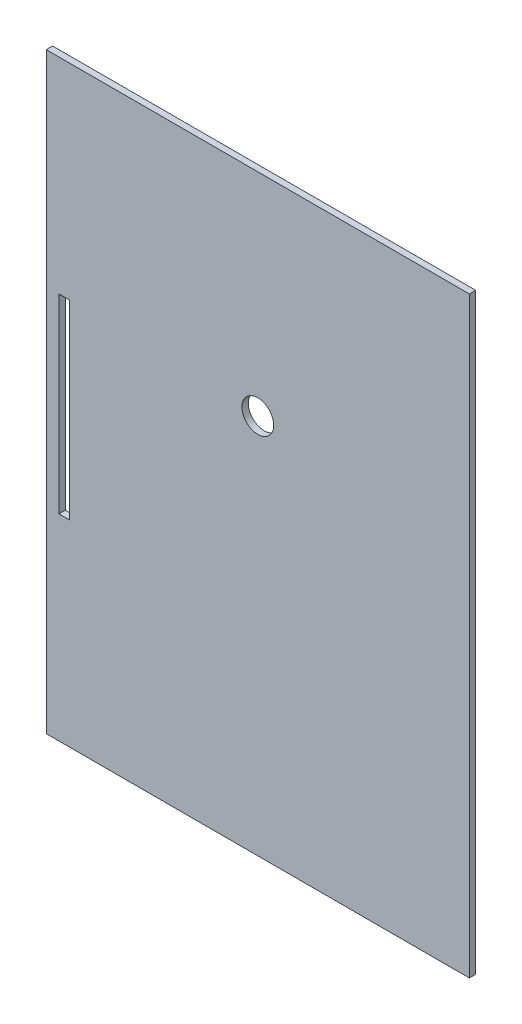
ISO-10303-21;
HEADER;
FILE_DESCRIPTION(('STEP AP214'),'2;1');
FILE_NAME('part.step','',(''),(''),'','','');
FILE_SCHEMA(('AUTOMOTIVE_DESIGN { 1 0 10303 214 1 1 1 1 }'));
ENDSEC;
DATA;
#1=APPLICATION_CONTEXT('core data for automotive mechanical design processes');
#2=APPLICATION_PROTOCOL_DEFINITION('international standard','automotive_design',2000,#1);
#3=PRODUCT_CONTEXT('',#1,'mechanical');
#4=PRODUCT('Part','Part','',(#3));
#5=PRODUCT_RELATED_PRODUCT_CATEGORY('part','',(#4));
#6=PRODUCT_DEFINITION_FORMATION('','',#4);
#7=PRODUCT_DEFINITION_CONTEXT('part definition',#1,'design');
#8=PRODUCT_DEFINITION('design','',#6,#7);
#9=PRODUCT_DEFINITION_SHAPE('','',#8);
#10=(LENGTH_UNIT() NAMED_UNIT(*) SI_UNIT(.MILLI.,.METRE.));
#11=(NAMED_UNIT(*) PLANE_ANGLE_UNIT() SI_UNIT($,.RADIAN.));
#12=(NAMED_UNIT(*) SI_UNIT($,.STERADIAN.) SOLID_ANGLE_UNIT());
#13=UNCERTAINTY_MEASURE_WITH_UNIT(LENGTH_MEASURE(1.E-05),#10,'distance_accuracy_value','');
#14=(GEOMETRIC_REPRESENTATION_CONTEXT(3) GLOBAL_UNCERTAINTY_ASSIGNED_CONTEXT((#13)) GLOBAL_UNIT_ASSIGNED_CONTEXT((#10,
#11,#12)) REPRESENTATION_CONTEXT('',''));
#15=CARTESIAN_POINT('',(0.,0.,0.));
#16=DIRECTION('',(0.,0.,1.));
#17=DIRECTION('',(1.,0.,0.));
#18=AXIS2_PLACEMENT_3D('',#15,#16,#17);
#19=CARTESIAN_POINT('',(0.,0.,3.));
#20=DIRECTION('',(0.,0.,1.));
#21=DIRECTION('',(1.,0.,0.));
#22=AXIS2_PLACEMENT_3D('',#19,#20,#21);
#23=PLANE('',#22);
#24=DIRECTION('',(1.,0.,0.));
#25=VECTOR('',#24,1.);
#26=CARTESIAN_POINT('',(-94.,-47.,3.));
#27=LINE('',#26,#25);
#28=CARTESIAN_POINT('',(-94.,-47.,3.));
#29=VERTEX_POINT('',#28);
#30=CARTESIAN_POINT('',(-89.,-47.,3.));
#31=VERTEX_POINT('',#30);
#32=EDGE_CURVE('E106',#29,#31,#27,.T.);
#33=ORIENTED_EDGE('',*,*,#32,.F.);
#34=DIRECTION('',(0.,-1.,0.));
#35=VECTOR('',#34,1.);
#36=CARTESIAN_POINT('',(-94.,43.,3.));
#37=LINE('',#36,#35);
#38=CARTESIAN_POINT('',(-94.,43.,3.));
#39=VERTEX_POINT('',#38);
#40=EDGE_CURVE('E98',#39,#29,#37,.T.);
#41=ORIENTED_EDGE('',*,*,#40,.F.);
#42=DIRECTION('',(-1.,0.,0.));
#43=VECTOR('',#42,1.);
#44=CARTESIAN_POINT('',(-94.,43.,3.));
#45=LINE('',#44,#43);
#46=CARTESIAN_POINT('',(-89.,43.,3.));
#47=VERTEX_POINT('',#46);
#48=EDGE_CURVE('E121',#47,#39,#45,.T.);
#49=ORIENTED_EDGE('',*,*,#48,.F.);
#50=DIRECTION('',(0.,1.,0.));
#51=VECTOR('',#50,1.);
#52=CARTESIAN_POINT('',(-89.,43.,3.));
#53=LINE('',#52,#51);
#54=EDGE_CURVE('E119',#31,#47,#53,.T.);
#55=ORIENTED_EDGE('',*,*,#54,.F.);
#56=EDGE_LOOP('',(#33,#41,#49,#55));
#57=FACE_BOUND('',#56,.T.);
#58=DIRECTION('',(0.,1.,0.));
#59=VECTOR('',#58,1.);
#60=CARTESIAN_POINT('',(100.,140.,3.));
#61=LINE('',#60,#59);
#62=CARTESIAN_POINT('',(100.,-140.,3.));
#63=VERTEX_POINT('',#62);
#64=CARTESIAN_POINT('',(100.,140.,3.));
#65=VERTEX_POINT('',#64);
#66=EDGE_CURVE('E137',#63,#65,#61,.T.);
#67=ORIENTED_EDGE('',*,*,#66,.T.);
#68=DIRECTION('',(-1.,0.,0.));
#69=VECTOR('',#68,1.);
#70=CARTESIAN_POINT('',(-100.,140.,3.));
#71=LINE('',#70,#69);
#72=CARTESIAN_POINT('',(-100.,140.,3.));
#73=VERTEX_POINT('',#72);
#74=EDGE_CURVE('E140',#65,#73,#71,.T.);
#75=ORIENTED_EDGE('',*,*,#74,.T.);
#76=DIRECTION('',(0.,-1.,0.));
#77=VECTOR('',#76,1.);
#78=CARTESIAN_POINT('',(-100.,140.,3.));
#79=LINE('',#78,#77);
#80=CARTESIAN_POINT('',(-100.,-140.,3.));
#81=VERTEX_POINT('',#80);
#82=EDGE_CURVE('E143',#73,#81,#79,.T.);
#83=ORIENTED_EDGE('',*,*,#82,.T.);
#84=DIRECTION('',(1.,0.,0.));
#85=VECTOR('',#84,1.);
#86=CARTESIAN_POINT('',(-100.,-140.,3.));
#87=LINE('',#86,#85);
#88=EDGE_CURVE('E145',#81,#63,#87,.T.);
#89=ORIENTED_EDGE('',*,*,#88,.T.);
#90=EDGE_LOOP('',(#67,#75,#83,#89));
#91=FACE_BOUND('',#90,.T.);
#92=CARTESIAN_POINT('',(0.,40.,3.));
#93=DIRECTION('',(0.,0.,1.));
#94=DIRECTION('',(1.,0.,0.));
#95=AXIS2_PLACEMENT_3D('',#92,#93,#94);
#96=CIRCLE('',#95,7.5);
#97=CARTESIAN_POINT('',(7.5,40.,3.));
#98=VERTEX_POINT('',#97);
#99=EDGE_CURVE('E127',#98,#98,#96,.T.);
#100=ORIENTED_EDGE('',*,*,#99,.F.);
#101=EDGE_LOOP('',(#100));
#102=FACE_BOUND('',#101,.T.);
#103=ADVANCED_FACE('F33',(#57,#91,#102),#23,.T.);
#104=CARTESIAN_POINT('',(0.,0.,0.));
#105=DIRECTION('',(0.,0.,1.));
#106=DIRECTION('',(1.,0.,0.));
#107=AXIS2_PLACEMENT_3D('',#104,#105,#106);
#108=PLANE('',#107);
#109=DIRECTION('',(0.,1.,0.));
#110=VECTOR('',#109,1.);
#111=CARTESIAN_POINT('',(100.,140.,0.));
#112=LINE('',#111,#110);
#113=CARTESIAN_POINT('',(100.,-140.,0.));
#114=VERTEX_POINT('',#113);
#115=CARTESIAN_POINT('',(100.,140.,0.));
#116=VERTEX_POINT('',#115);
#117=EDGE_CURVE('E114',#114,#116,#112,.T.);
#118=ORIENTED_EDGE('',*,*,#117,.F.);
#119=DIRECTION('',(1.,0.,0.));
#120=VECTOR('',#119,1.);
#121=CARTESIAN_POINT('',(-100.,-140.,0.));
#122=LINE('',#121,#120);
#123=CARTESIAN_POINT('',(-100.,-140.,0.));
#124=VERTEX_POINT('',#123);
#125=EDGE_CURVE('E141',#124,#114,#122,.T.);
#126=ORIENTED_EDGE('',*,*,#125,.F.);
#127=DIRECTION('',(0.,-1.,0.));
#128=VECTOR('',#127,1.);
#129=CARTESIAN_POINT('',(-100.,140.,0.));
#130=LINE('',#129,#128);
#131=CARTESIAN_POINT('',(-100.,140.,0.));
#132=VERTEX_POINT('',#131);
#133=EDGE_CURVE('E152',#132,#124,#130,.T.);
#134=ORIENTED_EDGE('',*,*,#133,.F.);
#135=DIRECTION('',(-1.,0.,0.));
#136=VECTOR('',#135,1.);
#137=CARTESIAN_POINT('',(-100.,140.,0.));
#138=LINE('',#137,#136);
#139=EDGE_CURVE('E150',#116,#132,#138,.T.);
#140=ORIENTED_EDGE('',*,*,#139,.F.);
#141=EDGE_LOOP('',(#118,#126,#134,#140));
#142=FACE_BOUND('',#141,.T.);
#143=DIRECTION('',(0.,-1.,0.));
#144=VECTOR('',#143,1.);
#145=CARTESIAN_POINT('',(-94.,43.,0.));
#146=LINE('',#145,#144);
#147=CARTESIAN_POINT('',(-94.,43.,0.));
#148=VERTEX_POINT('',#147);
#149=CARTESIAN_POINT('',(-94.,-47.,0.));
#150=VERTEX_POINT('',#149);
#151=EDGE_CURVE('E56',#148,#150,#146,.T.);
#152=ORIENTED_EDGE('',*,*,#151,.T.);
#153=DIRECTION('',(1.,0.,0.));
#154=VECTOR('',#153,1.);
#155=CARTESIAN_POINT('',(-94.,-47.,0.));
#156=LINE('',#155,#154);
#157=CARTESIAN_POINT('',(-89.,-47.,0.));
#158=VERTEX_POINT('',#157);
#159=EDGE_CURVE('E113',#150,#158,#156,.T.);
#160=ORIENTED_EDGE('',*,*,#159,.T.);
#161=DIRECTION('',(0.,1.,0.));
#162=VECTOR('',#161,1.);
#163=CARTESIAN_POINT('',(-89.,43.,0.));
#164=LINE('',#163,#162);
#165=CARTESIAN_POINT('',(-89.,43.,0.));
#166=VERTEX_POINT('',#165);
#167=EDGE_CURVE('E129',#158,#166,#164,.T.);
#168=ORIENTED_EDGE('',*,*,#167,.T.);
#169=DIRECTION('',(-1.,0.,0.));
#170=VECTOR('',#169,1.);
#171=CARTESIAN_POINT('',(-94.,43.,0.));
#172=LINE('',#171,#170);
#173=EDGE_CURVE('E107',#166,#148,#172,.T.);
#174=ORIENTED_EDGE('',*,*,#173,.T.);
#175=EDGE_LOOP('',(#152,#160,#168,#174));
#176=FACE_BOUND('',#175,.T.);
#177=CARTESIAN_POINT('',(0.,40.,0.));
#178=DIRECTION('',(0.,0.,1.));
#179=DIRECTION('',(1.,0.,0.));
#180=AXIS2_PLACEMENT_3D('',#177,#178,#179);
#181=CIRCLE('',#180,7.5);
#182=CARTESIAN_POINT('',(7.5,40.,0.));
#183=VERTEX_POINT('',#182);
#184=EDGE_CURVE('E223',#183,#183,#181,.T.);
#185=ORIENTED_EDGE('',*,*,#184,.T.);
#186=EDGE_LOOP('',(#185));
#187=FACE_BOUND('',#186,.T.);
#188=ADVANCED_FACE('F170',(#142,#176,#187),#108,.F.);
#189=CARTESIAN_POINT('',(100.,140.,3.));
#190=DIRECTION('',(-1.,0.,0.));
#191=DIRECTION('',(0.,-1.,0.));
#192=AXIS2_PLACEMENT_3D('',#189,#190,#191);
#193=PLANE('',#192);
#194=ORIENTED_EDGE('',*,*,#117,.T.);
#195=DIRECTION('',(0.,0.,-1.));
#196=VECTOR('',#195,1.);
#197=CARTESIAN_POINT('',(100.,140.,3.));
#198=LINE('',#197,#196);
#199=EDGE_CURVE('E11',#65,#116,#198,.T.);
#200=ORIENTED_EDGE('',*,*,#199,.F.);
#201=ORIENTED_EDGE('',*,*,#66,.F.);
#202=DIRECTION('',(0.,0.,-1.));
#203=VECTOR('',#202,1.);
#204=CARTESIAN_POINT('',(100.,-140.,3.));
#205=LINE('',#204,#203);
#206=EDGE_CURVE('E147',#63,#114,#205,.T.);
#207=ORIENTED_EDGE('',*,*,#206,.T.);
#208=EDGE_LOOP('',(#194,#200,#201,#207));
#209=FACE_BOUND('',#208,.T.);
#210=ADVANCED_FACE('F35',(#209),#193,.F.);
#211=CARTESIAN_POINT('',(-100.,140.,3.));
#212=DIRECTION('',(0.,-1.,0.));
#213=DIRECTION('',(0.,0.,-1.));
#214=AXIS2_PLACEMENT_3D('',#211,#212,#213);
#215=PLANE('',#214);
#216=ORIENTED_EDGE('',*,*,#139,.T.);
#217=DIRECTION('',(0.,0.,-1.));
#218=VECTOR('',#217,1.);
#219=CARTESIAN_POINT('',(-100.,140.,3.));
#220=LINE('',#219,#218);
#221=EDGE_CURVE('E41',#73,#132,#220,.T.);
#222=ORIENTED_EDGE('',*,*,#221,.F.);
#223=ORIENTED_EDGE('',*,*,#74,.F.);
#224=ORIENTED_EDGE('',*,*,#199,.T.);
#225=EDGE_LOOP('',(#216,#222,#223,#224));
#226=FACE_BOUND('',#225,.T.);
#227=ADVANCED_FACE('F180',(#226),#215,.F.);
#228=CARTESIAN_POINT('',(-100.,140.,3.));
#229=DIRECTION('',(1.,0.,0.));
#230=DIRECTION('',(0.,1.,0.));
#231=AXIS2_PLACEMENT_3D('',#228,#229,#230);
#232=PLANE('',#231);
#233=ORIENTED_EDGE('',*,*,#133,.T.);
#234=DIRECTION('',(0.,0.,-1.));
#235=VECTOR('',#234,1.);
#236=CARTESIAN_POINT('',(-100.,-140.,3.));
#237=LINE('',#236,#235);
#238=EDGE_CURVE('E157',#81,#124,#237,.T.);
#239=ORIENTED_EDGE('',*,*,#238,.F.);
#240=ORIENTED_EDGE('',*,*,#82,.F.);
#241=ORIENTED_EDGE('',*,*,#221,.T.);
#242=EDGE_LOOP('',(#233,#239,#240,#241));
#243=FACE_BOUND('',#242,.T.);
#244=ADVANCED_FACE('F164',(#243),#232,.F.);
#245=CARTESIAN_POINT('',(-100.,-140.,3.));
#246=DIRECTION('',(0.,1.,0.));
#247=DIRECTION('',(0.,0.,1.));
#248=AXIS2_PLACEMENT_3D('',#245,#246,#247);
#249=PLANE('',#248);
#250=ORIENTED_EDGE('',*,*,#125,.T.);
#251=ORIENTED_EDGE('',*,*,#206,.F.);
#252=ORIENTED_EDGE('',*,*,#88,.F.);
#253=ORIENTED_EDGE('',*,*,#238,.T.);
#254=EDGE_LOOP('',(#250,#251,#252,#253));
#255=FACE_BOUND('',#254,.T.);
#256=ADVANCED_FACE('F174',(#255),#249,.F.);
#257=CARTESIAN_POINT('',(-94.,43.,3.));
#258=DIRECTION('',(1.,0.,0.));
#259=DIRECTION('',(0.,0.,-1.));
#260=AXIS2_PLACEMENT_3D('',#257,#258,#259);
#261=PLANE('',#260);
#262=ORIENTED_EDGE('',*,*,#151,.F.);
#263=DIRECTION('',(0.,0.,-1.));
#264=VECTOR('',#263,1.);
#265=CARTESIAN_POINT('',(-94.,43.,3.));
#266=LINE('',#265,#264);
#267=EDGE_CURVE('E102',#39,#148,#266,.T.);
#268=ORIENTED_EDGE('',*,*,#267,.F.);
#269=ORIENTED_EDGE('',*,*,#40,.T.);
#270=DIRECTION('',(0.,0.,-1.));
#271=VECTOR('',#270,1.);
#272=CARTESIAN_POINT('',(-94.,-47.,3.));
#273=LINE('',#272,#271);
#274=EDGE_CURVE('E101',#29,#150,#273,.T.);
#275=ORIENTED_EDGE('',*,*,#274,.T.);
#276=EDGE_LOOP('',(#262,#268,#269,#275));
#277=FACE_BOUND('',#276,.T.);
#278=ADVANCED_FACE('F100',(#277),#261,.T.);
#279=CARTESIAN_POINT('',(-94.,-47.,3.));
#280=DIRECTION('',(0.,1.,0.));
#281=DIRECTION('',(0.,0.,1.));
#282=AXIS2_PLACEMENT_3D('',#279,#280,#281);
#283=PLANE('',#282);
#284=ORIENTED_EDGE('',*,*,#159,.F.);
#285=ORIENTED_EDGE('',*,*,#274,.F.);
#286=ORIENTED_EDGE('',*,*,#32,.T.);
#287=DIRECTION('',(0.,0.,-1.));
#288=VECTOR('',#287,1.);
#289=CARTESIAN_POINT('',(-89.,-47.,3.));
#290=LINE('',#289,#288);
#291=EDGE_CURVE('E115',#31,#158,#290,.T.);
#292=ORIENTED_EDGE('',*,*,#291,.T.);
#293=EDGE_LOOP('',(#284,#285,#286,#292));
#294=FACE_BOUND('',#293,.T.);
#295=ADVANCED_FACE('F110',(#294),#283,.T.);
#296=CARTESIAN_POINT('',(-89.,43.,3.));
#297=DIRECTION('',(-1.,0.,0.));
#298=DIRECTION('',(0.,-1.,0.));
#299=AXIS2_PLACEMENT_3D('',#296,#297,#298);
#300=PLANE('',#299);
#301=ORIENTED_EDGE('',*,*,#167,.F.);
#302=ORIENTED_EDGE('',*,*,#291,.F.);
#303=ORIENTED_EDGE('',*,*,#54,.T.);
#304=DIRECTION('',(0.,0.,-1.));
#305=VECTOR('',#304,1.);
#306=CARTESIAN_POINT('',(-89.,43.,3.));
#307=LINE('',#306,#305);
#308=EDGE_CURVE('E48',#47,#166,#307,.T.);
#309=ORIENTED_EDGE('',*,*,#308,.T.);
#310=EDGE_LOOP('',(#301,#302,#303,#309));
#311=FACE_BOUND('',#310,.T.);
#312=ADVANCED_FACE('F203',(#311),#300,.T.);
#313=CARTESIAN_POINT('',(-94.,43.,3.));
#314=DIRECTION('',(0.,-1.,0.));
#315=DIRECTION('',(0.,0.,-1.));
#316=AXIS2_PLACEMENT_3D('',#313,#314,#315);
#317=PLANE('',#316);
#318=ORIENTED_EDGE('',*,*,#173,.F.);
#319=ORIENTED_EDGE('',*,*,#308,.F.);
#320=ORIENTED_EDGE('',*,*,#48,.T.);
#321=ORIENTED_EDGE('',*,*,#267,.T.);
#322=EDGE_LOOP('',(#318,#319,#320,#321));
#323=FACE_BOUND('',#322,.T.);
#324=ADVANCED_FACE('F207',(#323),#317,.T.);
#325=CARTESIAN_POINT('',(0.,40.,3.));
#326=DIRECTION('',(0.,0.,-1.));
#327=DIRECTION('',(-1.,0.,0.));
#328=AXIS2_PLACEMENT_3D('',#325,#326,#327);
#329=CYLINDRICAL_SURFACE('',#328,7.5);
#330=ORIENTED_EDGE('',*,*,#99,.T.);
#331=EDGE_LOOP('',(#330));
#332=FACE_BOUND('',#331,.T.);
#333=ORIENTED_EDGE('',*,*,#184,.F.);
#334=EDGE_LOOP('',(#333));
#335=FACE_BOUND('',#334,.T.);
#336=ADVANCED_FACE('F213',(#332,#335),#329,.F.);
#337=CLOSED_SHELL('',(#103,#188,#210,#227,#244,#256,#278,#295,#312,#324,#336));
#338=MANIFOLD_SOLID_BREP('B2',#337);
#339=ADVANCED_BREP_SHAPE_REPRESENTATION('',(#18,#338),#14);
#340=SHAPE_DEFINITION_REPRESENTATION(#9,#339);
ENDSEC;
END-ISO-10303-21;
